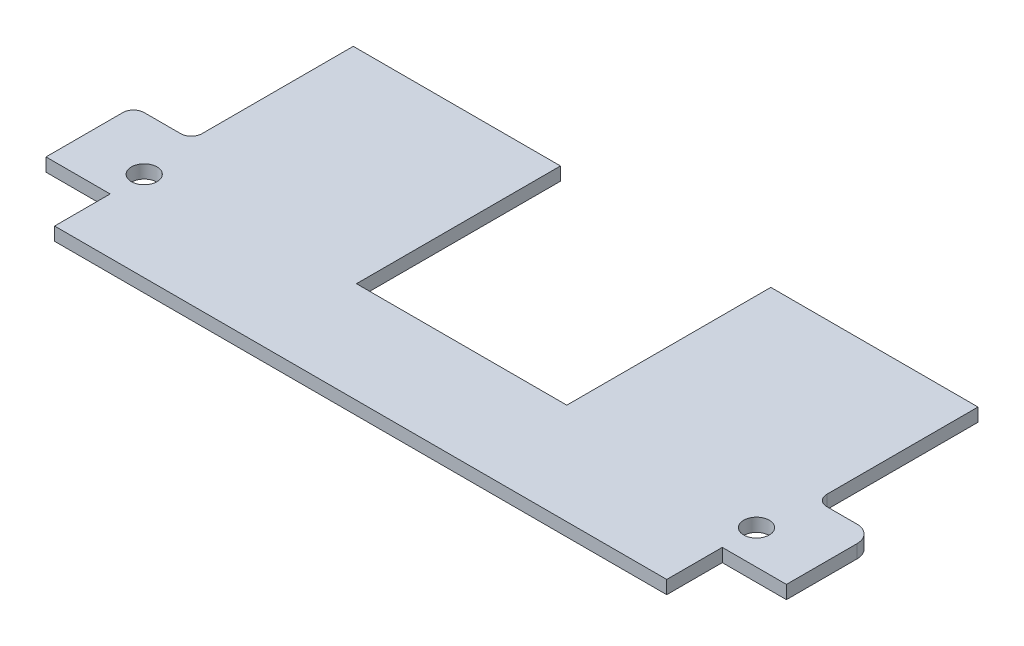
ISO-10303-21;
HEADER;
FILE_DESCRIPTION(('STEP AP214'),'2;1');
FILE_NAME('part.step','',(''),(''),'','','');
FILE_SCHEMA(('AUTOMOTIVE_DESIGN { 1 0 10303 214 1 1 1 1 }'));
ENDSEC;
DATA;
#1=APPLICATION_CONTEXT('core data for automotive mechanical design processes');
#2=APPLICATION_PROTOCOL_DEFINITION('international standard','automotive_design',2000,#1);
#3=PRODUCT_CONTEXT('',#1,'mechanical');
#4=PRODUCT('Part','Part','',(#3));
#5=PRODUCT_RELATED_PRODUCT_CATEGORY('part','',(#4));
#6=PRODUCT_DEFINITION_FORMATION('','',#4);
#7=PRODUCT_DEFINITION_CONTEXT('part definition',#1,'design');
#8=PRODUCT_DEFINITION('design','',#6,#7);
#9=PRODUCT_DEFINITION_SHAPE('','',#8);
#10=(LENGTH_UNIT() NAMED_UNIT(*) SI_UNIT(.MILLI.,.METRE.));
#11=(NAMED_UNIT(*) PLANE_ANGLE_UNIT() SI_UNIT($,.RADIAN.));
#12=(NAMED_UNIT(*) SI_UNIT($,.STERADIAN.) SOLID_ANGLE_UNIT());
#13=UNCERTAINTY_MEASURE_WITH_UNIT(LENGTH_MEASURE(1.E-05),#10,'distance_accuracy_value','');
#14=(GEOMETRIC_REPRESENTATION_CONTEXT(3) GLOBAL_UNCERTAINTY_ASSIGNED_CONTEXT((#13)) GLOBAL_UNIT_ASSIGNED_CONTEXT((#10,
#11,#12)) REPRESENTATION_CONTEXT('',''));
#15=CARTESIAN_POINT('',(0.,0.,0.));
#16=DIRECTION('',(0.,0.,1.));
#17=DIRECTION('',(1.,0.,0.));
#18=AXIS2_PLACEMENT_3D('',#15,#16,#17);
#19=CARTESIAN_POINT('',(42.3512933071951,1.575,31.615946891947));
#20=DIRECTION('',(0.,1.,0.));
#21=DIRECTION('',(0.,0.,1.));
#22=AXIS2_PLACEMENT_3D('',#19,#20,#21);
#23=PLANE('',#22);
#24=CARTESIAN_POINT('',(36.7272933151951,1.575,35.947946891947));
#25=DIRECTION('',(0.,1.,0.));
#26=DIRECTION('',(0.,0.,1.));
#27=AXIS2_PLACEMENT_3D('',#24,#25,#26);
#28=CIRCLE('',#27,1.52399999234956);
#29=CARTESIAN_POINT('',(36.7272933151951,1.575,37.4719468842965));
#30=VERTEX_POINT('',#29);
#31=EDGE_CURVE('E220',#30,#30,#28,.T.);
#32=ORIENTED_EDGE('',*,*,#31,.F.);
#33=EDGE_LOOP('',(#32));
#34=FACE_BOUND('',#33,.T.);
#35=DIRECTION('',(1.,0.,0.));
#36=VECTOR('',#35,1.);
#37=CARTESIAN_POINT('',(-29.6747066928049,1.575,46.615946891947));
#38=LINE('',#37,#36);
#39=CARTESIAN_POINT('',(-36.0247067008049,1.575,46.615946891947));
#40=VERTEX_POINT('',#39);
#41=CARTESIAN_POINT('',(36.7272933151951,1.575,46.615946891947));
#42=VERTEX_POINT('',#41);
#43=EDGE_CURVE('E59',#40,#42,#38,.T.);
#44=ORIENTED_EDGE('',*,*,#43,.T.);
#45=DIRECTION('',(0.,0.,-1.));
#46=VECTOR('',#45,1.);
#47=CARTESIAN_POINT('',(36.7272933151951,1.575,40.0144122461493));
#48=LINE('',#47,#46);
#49=CARTESIAN_POINT('',(36.7272933151951,1.575,40.0144122461493));
#50=VERTEX_POINT('',#49);
#51=EDGE_CURVE('E417',#42,#50,#48,.T.);
#52=ORIENTED_EDGE('',*,*,#51,.T.);
#53=DIRECTION('',(1.,0.,0.));
#54=VECTOR('',#53,1.);
#55=CARTESIAN_POINT('',(44.3512933071951,1.575,40.0144122461493));
#56=LINE('',#55,#54);
#57=CARTESIAN_POINT('',(44.3512933071951,1.575,40.0144122461493));
#58=VERTEX_POINT('',#57);
#59=EDGE_CURVE('E345',#50,#58,#56,.T.);
#60=ORIENTED_EDGE('',*,*,#59,.T.);
#61=DIRECTION('',(0.,0.,-1.));
#62=VECTOR('',#61,1.);
#63=CARTESIAN_POINT('',(44.3512933071951,1.575,40.0144122461493));
#64=LINE('',#63,#62);
#65=CARTESIAN_POINT('',(44.3512933071951,1.575,31.615946891947));
#66=VERTEX_POINT('',#65);
#67=EDGE_CURVE('E368',#58,#66,#64,.T.);
#68=ORIENTED_EDGE('',*,*,#67,.T.);
#69=CARTESIAN_POINT('',(42.3512933071951,1.575,31.615946891947));
#70=DIRECTION('',(0.,1.,0.));
#71=DIRECTION('',(0.,0.,1.));
#72=AXIS2_PLACEMENT_3D('',#69,#70,#71);
#73=CIRCLE('',#72,2.);
#74=CARTESIAN_POINT('',(42.3512933071951,1.575,29.615946891947));
#75=VERTEX_POINT('',#74);
#76=EDGE_CURVE('E364',#66,#75,#73,.T.);
#77=ORIENTED_EDGE('',*,*,#76,.T.);
#78=DIRECTION('',(-1.,0.,0.));
#79=VECTOR('',#78,1.);
#80=CARTESIAN_POINT('',(42.3512933071951,1.575,29.615946891947));
#81=LINE('',#80,#79);
#82=CARTESIAN_POINT('',(38.7462933071951,1.575,29.615946891947));
#83=VERTEX_POINT('',#82);
#84=EDGE_CURVE('E367',#75,#83,#81,.T.);
#85=ORIENTED_EDGE('',*,*,#84,.T.);
#86=CARTESIAN_POINT('',(38.7462933071951,1.575,28.345946891947));
#87=DIRECTION('',(0.,-1.,0.));
#88=DIRECTION('',(0.,0.,1.));
#89=AXIS2_PLACEMENT_3D('',#86,#87,#88);
#90=CIRCLE('',#89,1.26999999999999);
#91=CARTESIAN_POINT('',(37.4762933071951,1.575,28.345946891947));
#92=VERTEX_POINT('',#91);
#93=EDGE_CURVE('E372',#83,#92,#90,.T.);
#94=ORIENTED_EDGE('',*,*,#93,.T.);
#95=DIRECTION('',(0.,0.,-1.));
#96=VECTOR('',#95,1.);
#97=CARTESIAN_POINT('',(37.4762933071951,1.575,28.345946891947));
#98=LINE('',#97,#96);
#99=CARTESIAN_POINT('',(37.4762933071951,1.575,10.3704284449379));
#100=VERTEX_POINT('',#99);
#101=EDGE_CURVE('E379',#92,#100,#98,.T.);
#102=ORIENTED_EDGE('',*,*,#101,.T.);
#103=DIRECTION('',(-1.,0.,0.));
#104=VECTOR('',#103,1.);
#105=CARTESIAN_POINT('',(12.8512933071951,1.575,10.3704284449379));
#106=LINE('',#105,#104);
#107=CARTESIAN_POINT('',(12.8512933071951,1.575,10.3704284449379));
#108=VERTEX_POINT('',#107);
#109=EDGE_CURVE('E382',#100,#108,#106,.T.);
#110=ORIENTED_EDGE('',*,*,#109,.T.);
#111=DIRECTION('',(0.,0.,1.));
#112=VECTOR('',#111,1.);
#113=CARTESIAN_POINT('',(12.8512933071951,1.575,10.3704284449379));
#114=LINE('',#113,#112);
#115=CARTESIAN_POINT('',(12.8512933071951,1.575,34.615947015947));
#116=VERTEX_POINT('',#115);
#117=EDGE_CURVE('E385',#108,#116,#114,.T.);
#118=ORIENTED_EDGE('',*,*,#117,.T.);
#119=DIRECTION('',(-1.,0.,0.));
#120=VECTOR('',#119,1.);
#121=CARTESIAN_POINT('',(-12.1487066928049,1.575,34.615947015947));
#122=LINE('',#121,#120);
#123=CARTESIAN_POINT('',(-12.1487066928049,1.575,34.615947015947));
#124=VERTEX_POINT('',#123);
#125=EDGE_CURVE('E388',#116,#124,#122,.T.);
#126=ORIENTED_EDGE('',*,*,#125,.T.);
#127=DIRECTION('',(0.,0.,-1.));
#128=VECTOR('',#127,1.);
#129=CARTESIAN_POINT('',(-12.1487066928049,1.575,17.871301307947));
#130=LINE('',#129,#128);
#131=CARTESIAN_POINT('',(-12.1487066928049,1.575,10.3704284449379));
#132=VERTEX_POINT('',#131);
#133=EDGE_CURVE('E391',#124,#132,#130,.T.);
#134=ORIENTED_EDGE('',*,*,#133,.T.);
#135=DIRECTION('',(-1.,0.,0.));
#136=VECTOR('',#135,1.);
#137=CARTESIAN_POINT('',(-36.7737066928049,1.575,10.3704284449379));
#138=LINE('',#137,#136);
#139=CARTESIAN_POINT('',(-36.7737066928049,1.575,10.3704284449379));
#140=VERTEX_POINT('',#139);
#141=EDGE_CURVE('E394',#132,#140,#138,.T.);
#142=ORIENTED_EDGE('',*,*,#141,.T.);
#143=DIRECTION('',(0.,0.,1.));
#144=VECTOR('',#143,1.);
#145=CARTESIAN_POINT('',(-36.7737066928049,1.575,10.3704284449379));
#146=LINE('',#145,#144);
#147=CARTESIAN_POINT('',(-36.7737066928049,1.575,28.345946891947));
#148=VERTEX_POINT('',#147);
#149=EDGE_CURVE('E397',#140,#148,#146,.T.);
#150=ORIENTED_EDGE('',*,*,#149,.T.);
#151=CARTESIAN_POINT('',(-38.0437066928049,1.575,28.345946891947));
#152=DIRECTION('',(0.,-1.,0.));
#153=DIRECTION('',(0.,0.,1.));
#154=AXIS2_PLACEMENT_3D('',#151,#152,#153);
#155=CIRCLE('',#154,1.26999999999999);
#156=CARTESIAN_POINT('',(-38.0437066928049,1.575,29.615946891947));
#157=VERTEX_POINT('',#156);
#158=EDGE_CURVE('E400',#148,#157,#155,.T.);
#159=ORIENTED_EDGE('',*,*,#158,.T.);
#160=DIRECTION('',(-1.,0.,0.));
#161=VECTOR('',#160,1.);
#162=CARTESIAN_POINT('',(-38.0437066928049,1.575,29.615946891947));
#163=LINE('',#162,#161);
#164=CARTESIAN_POINT('',(-42.3787066928049,1.575,29.615946891947));
#165=VERTEX_POINT('',#164);
#166=EDGE_CURVE('E403',#157,#165,#163,.T.);
#167=ORIENTED_EDGE('',*,*,#166,.T.);
#168=CARTESIAN_POINT('',(-42.3787066928049,1.575,30.885946891947));
#169=DIRECTION('',(0.,1.,0.));
#170=DIRECTION('',(0.,0.,1.));
#171=AXIS2_PLACEMENT_3D('',#168,#169,#170);
#172=CIRCLE('',#171,1.26999999999999);
#173=CARTESIAN_POINT('',(-43.6487066928049,1.575,30.885946891947));
#174=VERTEX_POINT('',#173);
#175=EDGE_CURVE('E191',#165,#174,#172,.T.);
#176=ORIENTED_EDGE('',*,*,#175,.T.);
#177=DIRECTION('',(0.,0.,1.));
#178=VECTOR('',#177,1.);
#179=CARTESIAN_POINT('',(-43.6487066928049,1.575,30.885946891947));
#180=LINE('',#179,#178);
#181=CARTESIAN_POINT('',(-43.6487066928049,1.575,40.0144122461493));
#182=VERTEX_POINT('',#181);
#183=EDGE_CURVE('E185',#174,#182,#180,.T.);
#184=ORIENTED_EDGE('',*,*,#183,.T.);
#185=DIRECTION('',(1.,0.,0.));
#186=VECTOR('',#185,1.);
#187=CARTESIAN_POINT('',(-36.0247067008049,1.575,40.0144122461493));
#188=LINE('',#187,#186);
#189=CARTESIAN_POINT('',(-36.0247067008049,1.575,40.0144122461493));
#190=VERTEX_POINT('',#189);
#191=EDGE_CURVE('E189',#182,#190,#188,.T.);
#192=ORIENTED_EDGE('',*,*,#191,.T.);
#193=DIRECTION('',(0.,0.,1.));
#194=VECTOR('',#193,1.);
#195=CARTESIAN_POINT('',(-36.0247067008049,1.575,40.0144122461493));
#196=LINE('',#195,#194);
#197=EDGE_CURVE('E208',#190,#40,#196,.T.);
#198=ORIENTED_EDGE('',*,*,#197,.T.);
#199=EDGE_LOOP('',(#44,#52,#60,#68,#77,#85,#94,#102,#110,#118,#126,#134,#142,#150,#159,#167,
#176,#184,#192,#198));
#200=FACE_BOUND('',#199,.T.);
#201=CARTESIAN_POINT('',(-36.0247067008049,1.575,35.965946891947));
#202=DIRECTION('',(0.,1.,0.));
#203=DIRECTION('',(0.,0.,1.));
#204=AXIS2_PLACEMENT_3D('',#201,#202,#203);
#205=CIRCLE('',#204,1.52400000765045);
#206=CARTESIAN_POINT('',(-36.0247067008049,1.575,37.4899468995974));
#207=VERTEX_POINT('',#206);
#208=EDGE_CURVE('E429',#207,#207,#205,.T.);
#209=ORIENTED_EDGE('',*,*,#208,.F.);
#210=EDGE_LOOP('',(#209));
#211=FACE_BOUND('',#210,.T.);
#212=ADVANCED_FACE('F41',(#34,#200,#211),#23,.T.);
#213=CARTESIAN_POINT('',(42.3512933071951,0.,31.615946891947));
#214=DIRECTION('',(0.,1.,0.));
#215=DIRECTION('',(0.,0.,1.));
#216=AXIS2_PLACEMENT_3D('',#213,#214,#215);
#217=PLANE('',#216);
#218=CARTESIAN_POINT('',(36.7272933151951,0.,35.947946891947));
#219=DIRECTION('',(0.,1.,0.));
#220=DIRECTION('',(0.,0.,1.));
#221=AXIS2_PLACEMENT_3D('',#218,#219,#220);
#222=CIRCLE('',#221,1.52399999234956);
#223=CARTESIAN_POINT('',(36.7272933151951,0.,37.4719468842965));
#224=VERTEX_POINT('',#223);
#225=EDGE_CURVE('E425',#224,#224,#222,.T.);
#226=ORIENTED_EDGE('',*,*,#225,.T.);
#227=EDGE_LOOP('',(#226));
#228=FACE_BOUND('',#227,.T.);
#229=DIRECTION('',(0.,0.,-1.));
#230=VECTOR('',#229,1.);
#231=CARTESIAN_POINT('',(36.7272933151951,0.,40.0144122461493));
#232=LINE('',#231,#230);
#233=CARTESIAN_POINT('',(36.7272933151951,0.,46.615946891947));
#234=VERTEX_POINT('',#233);
#235=CARTESIAN_POINT('',(36.7272933151951,0.,40.0144122461493));
#236=VERTEX_POINT('',#235);
#237=EDGE_CURVE('E216',#234,#236,#232,.T.);
#238=ORIENTED_EDGE('',*,*,#237,.F.);
#239=DIRECTION('',(1.,0.,0.));
#240=VECTOR('',#239,1.);
#241=CARTESIAN_POINT('',(-36.0247067008049,0.,46.615946891947));
#242=LINE('',#241,#240);
#243=CARTESIAN_POINT('',(-36.0247067008049,0.,46.615946891947));
#244=VERTEX_POINT('',#243);
#245=EDGE_CURVE('E273',#244,#234,#242,.T.);
#246=ORIENTED_EDGE('',*,*,#245,.F.);
#247=DIRECTION('',(0.,0.,1.));
#248=VECTOR('',#247,1.);
#249=CARTESIAN_POINT('',(-36.0247067008049,0.,40.0144122461493));
#250=LINE('',#249,#248);
#251=CARTESIAN_POINT('',(-36.0247067008049,0.,40.0144122461493));
#252=VERTEX_POINT('',#251);
#253=EDGE_CURVE('E132',#252,#244,#250,.T.);
#254=ORIENTED_EDGE('',*,*,#253,.F.);
#255=DIRECTION('',(1.,0.,0.));
#256=VECTOR('',#255,1.);
#257=CARTESIAN_POINT('',(-36.0247067008049,0.,40.0144122461493));
#258=LINE('',#257,#256);
#259=CARTESIAN_POINT('',(-43.6487066928049,0.,40.0144122461493));
#260=VERTEX_POINT('',#259);
#261=EDGE_CURVE('E125',#260,#252,#258,.T.);
#262=ORIENTED_EDGE('',*,*,#261,.F.);
#263=DIRECTION('',(0.,0.,1.));
#264=VECTOR('',#263,1.);
#265=CARTESIAN_POINT('',(-43.6487066928049,0.,30.885946891947));
#266=LINE('',#265,#264);
#267=CARTESIAN_POINT('',(-43.6487066928049,0.,30.885946891947));
#268=VERTEX_POINT('',#267);
#269=EDGE_CURVE('E200',#268,#260,#266,.T.);
#270=ORIENTED_EDGE('',*,*,#269,.F.);
#271=CARTESIAN_POINT('',(-42.3787066928049,0.,30.885946891947));
#272=DIRECTION('',(0.,1.,0.));
#273=DIRECTION('',(0.,0.,1.));
#274=AXIS2_PLACEMENT_3D('',#271,#272,#273);
#275=CIRCLE('',#274,1.26999999999999);
#276=CARTESIAN_POINT('',(-42.3787066928049,0.,29.615946891947));
#277=VERTEX_POINT('',#276);
#278=EDGE_CURVE('E264',#277,#268,#275,.T.);
#279=ORIENTED_EDGE('',*,*,#278,.F.);
#280=DIRECTION('',(-1.,0.,0.));
#281=VECTOR('',#280,1.);
#282=CARTESIAN_POINT('',(-38.0437066928049,0.,29.615946891947));
#283=LINE('',#282,#281);
#284=CARTESIAN_POINT('',(-38.0437066928049,0.,29.615946891947));
#285=VERTEX_POINT('',#284);
#286=EDGE_CURVE('E261',#285,#277,#283,.T.);
#287=ORIENTED_EDGE('',*,*,#286,.F.);
#288=CARTESIAN_POINT('',(-38.0437066928049,0.,28.345946891947));
#289=DIRECTION('',(0.,-1.,0.));
#290=DIRECTION('',(0.,0.,1.));
#291=AXIS2_PLACEMENT_3D('',#288,#289,#290);
#292=CIRCLE('',#291,1.26999999999999);
#293=CARTESIAN_POINT('',(-36.7737066928049,0.,28.345946891947));
#294=VERTEX_POINT('',#293);
#295=EDGE_CURVE('E258',#294,#285,#292,.T.);
#296=ORIENTED_EDGE('',*,*,#295,.F.);
#297=DIRECTION('',(0.,0.,1.));
#298=VECTOR('',#297,1.);
#299=CARTESIAN_POINT('',(-36.7737066928049,0.,10.3704284449379));
#300=LINE('',#299,#298);
#301=CARTESIAN_POINT('',(-36.7737066928049,0.,10.3704284449379));
#302=VERTEX_POINT('',#301);
#303=EDGE_CURVE('E255',#302,#294,#300,.T.);
#304=ORIENTED_EDGE('',*,*,#303,.F.);
#305=DIRECTION('',(-1.,0.,0.));
#306=VECTOR('',#305,1.);
#307=CARTESIAN_POINT('',(-36.7737066928049,0.,10.3704284449379));
#308=LINE('',#307,#306);
#309=CARTESIAN_POINT('',(-12.1487066928049,0.,10.3704284449379));
#310=VERTEX_POINT('',#309);
#311=EDGE_CURVE('E252',#310,#302,#308,.T.);
#312=ORIENTED_EDGE('',*,*,#311,.F.);
#313=DIRECTION('',(0.,0.,-1.));
#314=VECTOR('',#313,1.);
#315=CARTESIAN_POINT('',(-12.1487066928049,0.,17.871301307947));
#316=LINE('',#315,#314);
#317=CARTESIAN_POINT('',(-12.1487066928049,0.,34.615947015947));
#318=VERTEX_POINT('',#317);
#319=EDGE_CURVE('E249',#318,#310,#316,.T.);
#320=ORIENTED_EDGE('',*,*,#319,.F.);
#321=DIRECTION('',(-1.,0.,0.));
#322=VECTOR('',#321,1.);
#323=CARTESIAN_POINT('',(-12.1487066928049,0.,34.615947015947));
#324=LINE('',#323,#322);
#325=CARTESIAN_POINT('',(12.8512933071951,0.,34.615947015947));
#326=VERTEX_POINT('',#325);
#327=EDGE_CURVE('E245',#326,#318,#324,.T.);
#328=ORIENTED_EDGE('',*,*,#327,.F.);
#329=DIRECTION('',(0.,0.,1.));
#330=VECTOR('',#329,1.);
#331=CARTESIAN_POINT('',(12.8512933071951,0.,17.871301307947));
#332=LINE('',#331,#330);
#333=CARTESIAN_POINT('',(12.8512933071951,0.,10.3704284449379));
#334=VERTEX_POINT('',#333);
#335=EDGE_CURVE('E242',#334,#326,#332,.T.);
#336=ORIENTED_EDGE('',*,*,#335,.F.);
#337=DIRECTION('',(-1.,0.,0.));
#338=VECTOR('',#337,1.);
#339=CARTESIAN_POINT('',(12.8512933071951,0.,10.3704284449379));
#340=LINE('',#339,#338);
#341=CARTESIAN_POINT('',(37.4762933071951,0.,10.3704284449379));
#342=VERTEX_POINT('',#341);
#343=EDGE_CURVE('E238',#342,#334,#340,.T.);
#344=ORIENTED_EDGE('',*,*,#343,.F.);
#345=DIRECTION('',(0.,0.,-1.));
#346=VECTOR('',#345,1.);
#347=CARTESIAN_POINT('',(37.4762933071951,0.,28.345946891947));
#348=LINE('',#347,#346);
#349=CARTESIAN_POINT('',(37.4762933071951,0.,28.345946891947));
#350=VERTEX_POINT('',#349);
#351=EDGE_CURVE('E235',#350,#342,#348,.T.);
#352=ORIENTED_EDGE('',*,*,#351,.F.);
#353=CARTESIAN_POINT('',(38.7462933071951,0.,28.345946891947));
#354=DIRECTION('',(0.,-1.,0.));
#355=DIRECTION('',(0.,0.,1.));
#356=AXIS2_PLACEMENT_3D('',#353,#354,#355);
#357=CIRCLE('',#356,1.26999999999999);
#358=CARTESIAN_POINT('',(38.7462933071951,0.,29.615946891947));
#359=VERTEX_POINT('',#358);
#360=EDGE_CURVE('E232',#359,#350,#357,.T.);
#361=ORIENTED_EDGE('',*,*,#360,.F.);
#362=DIRECTION('',(-1.,0.,0.));
#363=VECTOR('',#362,1.);
#364=CARTESIAN_POINT('',(42.3512933071951,0.,29.615946891947));
#365=LINE('',#364,#363);
#366=CARTESIAN_POINT('',(42.3512933071951,0.,29.615946891947));
#367=VERTEX_POINT('',#366);
#368=EDGE_CURVE('E229',#367,#359,#365,.T.);
#369=ORIENTED_EDGE('',*,*,#368,.F.);
#370=CARTESIAN_POINT('',(42.3512933071951,0.,31.615946891947));
#371=DIRECTION('',(0.,1.,0.));
#372=DIRECTION('',(0.,0.,1.));
#373=AXIS2_PLACEMENT_3D('',#370,#371,#372);
#374=CIRCLE('',#373,2.);
#375=CARTESIAN_POINT('',(44.3512933071951,0.,31.615946891947));
#376=VERTEX_POINT('',#375);
#377=EDGE_CURVE('E226',#376,#367,#374,.T.);
#378=ORIENTED_EDGE('',*,*,#377,.F.);
#379=DIRECTION('',(0.,0.,-1.));
#380=VECTOR('',#379,1.);
#381=CARTESIAN_POINT('',(44.3512933071951,0.,40.0144122461493));
#382=LINE('',#381,#380);
#383=CARTESIAN_POINT('',(44.3512933071951,0.,40.0144122461493));
#384=VERTEX_POINT('',#383);
#385=EDGE_CURVE('E223',#384,#376,#382,.T.);
#386=ORIENTED_EDGE('',*,*,#385,.F.);
#387=DIRECTION('',(1.,0.,0.));
#388=VECTOR('',#387,1.);
#389=CARTESIAN_POINT('',(44.3512933071951,0.,40.0144122461493));
#390=LINE('',#389,#388);
#391=EDGE_CURVE('E219',#236,#384,#390,.T.);
#392=ORIENTED_EDGE('',*,*,#391,.F.);
#393=EDGE_LOOP('',(#238,#246,#254,#262,#270,#279,#287,#296,#304,#312,#320,#328,#336,#344,#352,
#361,#369,#378,#386,#392));
#394=FACE_BOUND('',#393,.T.);
#395=CARTESIAN_POINT('',(-36.0247067008049,0.,35.965946891947));
#396=DIRECTION('',(0.,1.,0.));
#397=DIRECTION('',(0.,0.,1.));
#398=AXIS2_PLACEMENT_3D('',#395,#396,#397);
#399=CIRCLE('',#398,1.52400000765045);
#400=CARTESIAN_POINT('',(-36.0247067008049,0.,37.4899468995974));
#401=VERTEX_POINT('',#400);
#402=EDGE_CURVE('E432',#401,#401,#399,.T.);
#403=ORIENTED_EDGE('',*,*,#402,.T.);
#404=EDGE_LOOP('',(#403));
#405=FACE_BOUND('',#404,.T.);
#406=ADVANCED_FACE('F351',(#228,#394,#405),#217,.F.);
#407=CARTESIAN_POINT('',(36.7272933151951,1.575,40.0144122461493));
#408=DIRECTION('',(-1.,0.,0.));
#409=DIRECTION('',(0.,0.,1.));
#410=AXIS2_PLACEMENT_3D('',#407,#408,#409);
#411=PLANE('',#410);
#412=ORIENTED_EDGE('',*,*,#237,.T.);
#413=DIRECTION('',(0.,-1.,0.));
#414=VECTOR('',#413,1.);
#415=CARTESIAN_POINT('',(36.7272933151951,1.575,40.0144122461493));
#416=LINE('',#415,#414);
#417=EDGE_CURVE('E51',#50,#236,#416,.T.);
#418=ORIENTED_EDGE('',*,*,#417,.F.);
#419=ORIENTED_EDGE('',*,*,#51,.F.);
#420=DIRECTION('',(0.,-1.,0.));
#421=VECTOR('',#420,1.);
#422=CARTESIAN_POINT('',(36.7272933151951,1.575,46.615946891947));
#423=LINE('',#422,#421);
#424=EDGE_CURVE('E11',#42,#234,#423,.T.);
#425=ORIENTED_EDGE('',*,*,#424,.T.);
#426=EDGE_LOOP('',(#412,#418,#419,#425));
#427=FACE_BOUND('',#426,.T.);
#428=ADVANCED_FACE('F43',(#427),#411,.F.);
#429=CARTESIAN_POINT('',(44.3512933071951,1.575,40.0144122461493));
#430=DIRECTION('',(0.,0.,-1.));
#431=DIRECTION('',(-1.,0.,0.));
#432=AXIS2_PLACEMENT_3D('',#429,#430,#431);
#433=PLANE('',#432);
#434=ORIENTED_EDGE('',*,*,#391,.T.);
#435=DIRECTION('',(0.,-1.,0.));
#436=VECTOR('',#435,1.);
#437=CARTESIAN_POINT('',(44.3512933071951,1.575,40.0144122461493));
#438=LINE('',#437,#436);
#439=EDGE_CURVE('E333',#58,#384,#438,.T.);
#440=ORIENTED_EDGE('',*,*,#439,.F.);
#441=ORIENTED_EDGE('',*,*,#59,.F.);
#442=ORIENTED_EDGE('',*,*,#417,.T.);
#443=EDGE_LOOP('',(#434,#440,#441,#442));
#444=FACE_BOUND('',#443,.T.);
#445=ADVANCED_FACE('F343',(#444),#433,.F.);
#446=CARTESIAN_POINT('',(44.3512933071951,1.575,40.0144122461493));
#447=DIRECTION('',(-1.,0.,0.));
#448=DIRECTION('',(0.,0.,1.));
#449=AXIS2_PLACEMENT_3D('',#446,#447,#448);
#450=PLANE('',#449);
#451=ORIENTED_EDGE('',*,*,#385,.T.);
#452=DIRECTION('',(0.,-1.,0.));
#453=VECTOR('',#452,1.);
#454=CARTESIAN_POINT('',(44.3512933071951,1.575,31.615946891947));
#455=LINE('',#454,#453);
#456=EDGE_CURVE('E329',#66,#376,#455,.T.);
#457=ORIENTED_EDGE('',*,*,#456,.F.);
#458=ORIENTED_EDGE('',*,*,#67,.F.);
#459=ORIENTED_EDGE('',*,*,#439,.T.);
#460=EDGE_LOOP('',(#451,#457,#458,#459));
#461=FACE_BOUND('',#460,.T.);
#462=ADVANCED_FACE('F358',(#461),#450,.F.);
#463=CARTESIAN_POINT('',(42.3512933071951,1.575,31.615946891947));
#464=DIRECTION('',(0.,-1.,0.));
#465=DIRECTION('',(0.,0.,-1.));
#466=AXIS2_PLACEMENT_3D('',#463,#464,#465);
#467=CYLINDRICAL_SURFACE('',#466,2.);
#468=ORIENTED_EDGE('',*,*,#377,.T.);
#469=DIRECTION('',(0.,-1.,0.));
#470=VECTOR('',#469,1.);
#471=CARTESIAN_POINT('',(42.3512933071951,1.575,29.615946891947));
#472=LINE('',#471,#470);
#473=EDGE_CURVE('E325',#75,#367,#472,.T.);
#474=ORIENTED_EDGE('',*,*,#473,.F.);
#475=ORIENTED_EDGE('',*,*,#76,.F.);
#476=ORIENTED_EDGE('',*,*,#456,.T.);
#477=EDGE_LOOP('',(#468,#474,#475,#476));
#478=FACE_BOUND('',#477,.T.);
#479=ADVANCED_FACE('F362',(#478),#467,.T.);
#480=CARTESIAN_POINT('',(42.3512933071951,1.575,29.615946891947));
#481=DIRECTION('',(0.,0.,1.));
#482=DIRECTION('',(1.,0.,0.));
#483=AXIS2_PLACEMENT_3D('',#480,#481,#482);
#484=PLANE('',#483);
#485=ORIENTED_EDGE('',*,*,#368,.T.);
#486=DIRECTION('',(0.,-1.,0.));
#487=VECTOR('',#486,1.);
#488=CARTESIAN_POINT('',(38.7462933071951,1.575,29.615946891947));
#489=LINE('',#488,#487);
#490=EDGE_CURVE('E321',#83,#359,#489,.T.);
#491=ORIENTED_EDGE('',*,*,#490,.F.);
#492=ORIENTED_EDGE('',*,*,#84,.F.);
#493=ORIENTED_EDGE('',*,*,#473,.T.);
#494=EDGE_LOOP('',(#485,#491,#492,#493));
#495=FACE_BOUND('',#494,.T.);
#496=ADVANCED_FACE('F502',(#495),#484,.F.);
#497=CARTESIAN_POINT('',(38.7462933071951,1.575,28.345946891947));
#498=DIRECTION('',(0.,-1.,0.));
#499=DIRECTION('',(0.,0.,-1.));
#500=AXIS2_PLACEMENT_3D('',#497,#498,#499);
#501=CYLINDRICAL_SURFACE('',#500,1.26999999999999);
#502=ORIENTED_EDGE('',*,*,#360,.T.);
#503=DIRECTION('',(0.,-1.,0.));
#504=VECTOR('',#503,1.);
#505=CARTESIAN_POINT('',(37.4762933071951,1.575,28.345946891947));
#506=LINE('',#505,#504);
#507=EDGE_CURVE('E317',#92,#350,#506,.T.);
#508=ORIENTED_EDGE('',*,*,#507,.F.);
#509=ORIENTED_EDGE('',*,*,#93,.F.);
#510=ORIENTED_EDGE('',*,*,#490,.T.);
#511=EDGE_LOOP('',(#502,#508,#509,#510));
#512=FACE_BOUND('',#511,.T.);
#513=ADVANCED_FACE('F498',(#512),#501,.F.);
#514=CARTESIAN_POINT('',(37.4762933071951,1.575,28.345946891947));
#515=DIRECTION('',(-1.,0.,0.));
#516=DIRECTION('',(0.,0.,1.));
#517=AXIS2_PLACEMENT_3D('',#514,#515,#516);
#518=PLANE('',#517);
#519=ORIENTED_EDGE('',*,*,#351,.T.);
#520=DIRECTION('',(0.,-1.,0.));
#521=VECTOR('',#520,1.);
#522=CARTESIAN_POINT('',(37.4762933071951,1.575,10.3704284449379));
#523=LINE('',#522,#521);
#524=EDGE_CURVE('E313',#100,#342,#523,.T.);
#525=ORIENTED_EDGE('',*,*,#524,.F.);
#526=ORIENTED_EDGE('',*,*,#101,.F.);
#527=ORIENTED_EDGE('',*,*,#507,.T.);
#528=EDGE_LOOP('',(#519,#525,#526,#527));
#529=FACE_BOUND('',#528,.T.);
#530=ADVANCED_FACE('F494',(#529),#518,.F.);
#531=CARTESIAN_POINT('',(12.8512933071951,1.575,10.3704284449379));
#532=DIRECTION('',(0.,0.,1.));
#533=DIRECTION('',(1.,0.,0.));
#534=AXIS2_PLACEMENT_3D('',#531,#532,#533);
#535=PLANE('',#534);
#536=ORIENTED_EDGE('',*,*,#343,.T.);
#537=DIRECTION('',(0.,-1.,0.));
#538=VECTOR('',#537,1.);
#539=CARTESIAN_POINT('',(12.8512933071951,1.575,10.3704284449379));
#540=LINE('',#539,#538);
#541=EDGE_CURVE('E309',#108,#334,#540,.T.);
#542=ORIENTED_EDGE('',*,*,#541,.F.);
#543=ORIENTED_EDGE('',*,*,#109,.F.);
#544=ORIENTED_EDGE('',*,*,#524,.T.);
#545=EDGE_LOOP('',(#536,#542,#543,#544));
#546=FACE_BOUND('',#545,.T.);
#547=ADVANCED_FACE('F490',(#546),#535,.F.);
#548=CARTESIAN_POINT('',(12.8512933071951,1.575,17.871301307947));
#549=DIRECTION('',(1.,0.,0.));
#550=DIRECTION('',(0.,0.,-1.));
#551=AXIS2_PLACEMENT_3D('',#548,#549,#550);
#552=PLANE('',#551);
#553=ORIENTED_EDGE('',*,*,#335,.T.);
#554=DIRECTION('',(0.,-1.,0.));
#555=VECTOR('',#554,1.);
#556=CARTESIAN_POINT('',(12.8512933071951,1.575,34.615947015947));
#557=LINE('',#556,#555);
#558=EDGE_CURVE('E305',#116,#326,#557,.T.);
#559=ORIENTED_EDGE('',*,*,#558,.F.);
#560=ORIENTED_EDGE('',*,*,#117,.F.);
#561=ORIENTED_EDGE('',*,*,#541,.T.);
#562=EDGE_LOOP('',(#553,#559,#560,#561));
#563=FACE_BOUND('',#562,.T.);
#564=ADVANCED_FACE('F486',(#563),#552,.F.);
#565=CARTESIAN_POINT('',(-12.1487066928049,1.575,34.615947015947));
#566=DIRECTION('',(0.,0.,1.));
#567=DIRECTION('',(1.,0.,0.));
#568=AXIS2_PLACEMENT_3D('',#565,#566,#567);
#569=PLANE('',#568);
#570=ORIENTED_EDGE('',*,*,#327,.T.);
#571=DIRECTION('',(0.,-1.,0.));
#572=VECTOR('',#571,1.);
#573=CARTESIAN_POINT('',(-12.1487066928049,1.575,34.615947015947));
#574=LINE('',#573,#572);
#575=EDGE_CURVE('E301',#124,#318,#574,.T.);
#576=ORIENTED_EDGE('',*,*,#575,.F.);
#577=ORIENTED_EDGE('',*,*,#125,.F.);
#578=ORIENTED_EDGE('',*,*,#558,.T.);
#579=EDGE_LOOP('',(#570,#576,#577,#578));
#580=FACE_BOUND('',#579,.T.);
#581=ADVANCED_FACE('F482',(#580),#569,.F.);
#582=CARTESIAN_POINT('',(-12.1487066928049,1.575,17.871301307947));
#583=DIRECTION('',(-1.,0.,0.));
#584=DIRECTION('',(0.,0.,1.));
#585=AXIS2_PLACEMENT_3D('',#582,#583,#584);
#586=PLANE('',#585);
#587=ORIENTED_EDGE('',*,*,#319,.T.);
#588=DIRECTION('',(0.,-1.,0.));
#589=VECTOR('',#588,1.);
#590=CARTESIAN_POINT('',(-12.1487066928049,1.575,10.3704284449379));
#591=LINE('',#590,#589);
#592=EDGE_CURVE('E297',#132,#310,#591,.T.);
#593=ORIENTED_EDGE('',*,*,#592,.F.);
#594=ORIENTED_EDGE('',*,*,#133,.F.);
#595=ORIENTED_EDGE('',*,*,#575,.T.);
#596=EDGE_LOOP('',(#587,#593,#594,#595));
#597=FACE_BOUND('',#596,.T.);
#598=ADVANCED_FACE('F478',(#597),#586,.F.);
#599=CARTESIAN_POINT('',(-36.7737066928049,1.575,10.3704284449379));
#600=DIRECTION('',(0.,0.,1.));
#601=DIRECTION('',(1.,0.,0.));
#602=AXIS2_PLACEMENT_3D('',#599,#600,#601);
#603=PLANE('',#602);
#604=ORIENTED_EDGE('',*,*,#311,.T.);
#605=DIRECTION('',(0.,-1.,0.));
#606=VECTOR('',#605,1.);
#607=CARTESIAN_POINT('',(-36.7737066928049,1.575,10.3704284449379));
#608=LINE('',#607,#606);
#609=EDGE_CURVE('E293',#140,#302,#608,.T.);
#610=ORIENTED_EDGE('',*,*,#609,.F.);
#611=ORIENTED_EDGE('',*,*,#141,.F.);
#612=ORIENTED_EDGE('',*,*,#592,.T.);
#613=EDGE_LOOP('',(#604,#610,#611,#612));
#614=FACE_BOUND('',#613,.T.);
#615=ADVANCED_FACE('F474',(#614),#603,.F.);
#616=CARTESIAN_POINT('',(-36.7737066928049,1.575,10.3704284449379));
#617=DIRECTION('',(1.,0.,0.));
#618=DIRECTION('',(0.,0.,-1.));
#619=AXIS2_PLACEMENT_3D('',#616,#617,#618);
#620=PLANE('',#619);
#621=ORIENTED_EDGE('',*,*,#303,.T.);
#622=DIRECTION('',(0.,-1.,0.));
#623=VECTOR('',#622,1.);
#624=CARTESIAN_POINT('',(-36.7737066928049,1.575,28.345946891947));
#625=LINE('',#624,#623);
#626=EDGE_CURVE('E289',#148,#294,#625,.T.);
#627=ORIENTED_EDGE('',*,*,#626,.F.);
#628=ORIENTED_EDGE('',*,*,#149,.F.);
#629=ORIENTED_EDGE('',*,*,#609,.T.);
#630=EDGE_LOOP('',(#621,#627,#628,#629));
#631=FACE_BOUND('',#630,.T.);
#632=ADVANCED_FACE('F470',(#631),#620,.F.);
#633=CARTESIAN_POINT('',(-38.0437066928049,1.575,28.345946891947));
#634=DIRECTION('',(0.,-1.,0.));
#635=DIRECTION('',(0.,0.,-1.));
#636=AXIS2_PLACEMENT_3D('',#633,#634,#635);
#637=CYLINDRICAL_SURFACE('',#636,1.26999999999999);
#638=ORIENTED_EDGE('',*,*,#295,.T.);
#639=DIRECTION('',(0.,-1.,0.));
#640=VECTOR('',#639,1.);
#641=CARTESIAN_POINT('',(-38.0437066928049,1.575,29.615946891947));
#642=LINE('',#641,#640);
#643=EDGE_CURVE('E285',#157,#285,#642,.T.);
#644=ORIENTED_EDGE('',*,*,#643,.F.);
#645=ORIENTED_EDGE('',*,*,#158,.F.);
#646=ORIENTED_EDGE('',*,*,#626,.T.);
#647=EDGE_LOOP('',(#638,#644,#645,#646));
#648=FACE_BOUND('',#647,.T.);
#649=ADVANCED_FACE('F467',(#648),#637,.F.);
#650=CARTESIAN_POINT('',(-38.0437066928049,1.575,29.615946891947));
#651=DIRECTION('',(0.,0.,1.));
#652=DIRECTION('',(1.,0.,0.));
#653=AXIS2_PLACEMENT_3D('',#650,#651,#652);
#654=PLANE('',#653);
#655=ORIENTED_EDGE('',*,*,#286,.T.);
#656=DIRECTION('',(0.,-1.,0.));
#657=VECTOR('',#656,1.);
#658=CARTESIAN_POINT('',(-42.3787066928049,1.575,29.615946891947));
#659=LINE('',#658,#657);
#660=EDGE_CURVE('E281',#165,#277,#659,.T.);
#661=ORIENTED_EDGE('',*,*,#660,.F.);
#662=ORIENTED_EDGE('',*,*,#166,.F.);
#663=ORIENTED_EDGE('',*,*,#643,.T.);
#664=EDGE_LOOP('',(#655,#661,#662,#663));
#665=FACE_BOUND('',#664,.T.);
#666=ADVANCED_FACE('F411',(#665),#654,.F.);
#667=CARTESIAN_POINT('',(-42.3787066928049,1.575,30.885946891947));
#668=DIRECTION('',(0.,-1.,0.));
#669=DIRECTION('',(0.,0.,-1.));
#670=AXIS2_PLACEMENT_3D('',#667,#668,#669);
#671=CYLINDRICAL_SURFACE('',#670,1.26999999999999);
#672=ORIENTED_EDGE('',*,*,#278,.T.);
#673=DIRECTION('',(0.,-1.,0.));
#674=VECTOR('',#673,1.);
#675=CARTESIAN_POINT('',(-43.6487066928049,1.575,30.885946891947));
#676=LINE('',#675,#674);
#677=EDGE_CURVE('E202',#174,#268,#676,.T.);
#678=ORIENTED_EDGE('',*,*,#677,.F.);
#679=ORIENTED_EDGE('',*,*,#175,.F.);
#680=ORIENTED_EDGE('',*,*,#660,.T.);
#681=EDGE_LOOP('',(#672,#678,#679,#680));
#682=FACE_BOUND('',#681,.T.);
#683=ADVANCED_FACE('F415',(#682),#671,.T.);
#684=CARTESIAN_POINT('',(-43.6487066928049,1.575,30.885946891947));
#685=DIRECTION('',(1.,0.,0.));
#686=DIRECTION('',(0.,0.,-1.));
#687=AXIS2_PLACEMENT_3D('',#684,#685,#686);
#688=PLANE('',#687);
#689=ORIENTED_EDGE('',*,*,#269,.T.);
#690=DIRECTION('',(0.,-1.,0.));
#691=VECTOR('',#690,1.);
#692=CARTESIAN_POINT('',(-43.6487066928049,1.575,40.0144122461493));
#693=LINE('',#692,#691);
#694=EDGE_CURVE('E197',#182,#260,#693,.T.);
#695=ORIENTED_EDGE('',*,*,#694,.F.);
#696=ORIENTED_EDGE('',*,*,#183,.F.);
#697=ORIENTED_EDGE('',*,*,#677,.T.);
#698=EDGE_LOOP('',(#689,#695,#696,#697));
#699=FACE_BOUND('',#698,.T.);
#700=ADVANCED_FACE('F198',(#699),#688,.F.);
#701=CARTESIAN_POINT('',(-36.0247067008049,1.575,40.0144122461493));
#702=DIRECTION('',(0.,0.,-1.));
#703=DIRECTION('',(-1.,0.,0.));
#704=AXIS2_PLACEMENT_3D('',#701,#702,#703);
#705=PLANE('',#704);
#706=ORIENTED_EDGE('',*,*,#261,.T.);
#707=DIRECTION('',(0.,-1.,0.));
#708=VECTOR('',#707,1.);
#709=CARTESIAN_POINT('',(-36.0247067008049,1.575,40.0144122461493));
#710=LINE('',#709,#708);
#711=EDGE_CURVE('E203',#190,#252,#710,.T.);
#712=ORIENTED_EDGE('',*,*,#711,.F.);
#713=ORIENTED_EDGE('',*,*,#191,.F.);
#714=ORIENTED_EDGE('',*,*,#694,.T.);
#715=EDGE_LOOP('',(#706,#712,#713,#714));
#716=FACE_BOUND('',#715,.T.);
#717=ADVANCED_FACE('F205',(#716),#705,.F.);
#718=CARTESIAN_POINT('',(-36.0247067008049,1.575,40.0144122461493));
#719=DIRECTION('',(1.,0.,0.));
#720=DIRECTION('',(0.,0.,-1.));
#721=AXIS2_PLACEMENT_3D('',#718,#719,#720);
#722=PLANE('',#721);
#723=ORIENTED_EDGE('',*,*,#253,.T.);
#724=DIRECTION('',(0.,-1.,0.));
#725=VECTOR('',#724,1.);
#726=CARTESIAN_POINT('',(-36.0247067008049,1.575,46.615946891947));
#727=LINE('',#726,#725);
#728=EDGE_CURVE('E212',#40,#244,#727,.T.);
#729=ORIENTED_EDGE('',*,*,#728,.F.);
#730=ORIENTED_EDGE('',*,*,#197,.F.);
#731=ORIENTED_EDGE('',*,*,#711,.T.);
#732=EDGE_LOOP('',(#723,#729,#730,#731));
#733=FACE_BOUND('',#732,.T.);
#734=ADVANCED_FACE('F456',(#733),#722,.F.);
#735=CARTESIAN_POINT('',(-36.0247067008049,1.575,46.615946891947));
#736=DIRECTION('',(0.,0.,-1.));
#737=DIRECTION('',(-1.,0.,0.));
#738=AXIS2_PLACEMENT_3D('',#735,#736,#737);
#739=PLANE('',#738);
#740=ORIENTED_EDGE('',*,*,#245,.T.);
#741=ORIENTED_EDGE('',*,*,#424,.F.);
#742=ORIENTED_EDGE('',*,*,#43,.F.);
#743=ORIENTED_EDGE('',*,*,#728,.T.);
#744=EDGE_LOOP('',(#740,#741,#742,#743));
#745=FACE_BOUND('',#744,.T.);
#746=ADVANCED_FACE('F416',(#745),#739,.F.);
#747=CARTESIAN_POINT('',(36.7272933151951,1.575,35.947946891947));
#748=DIRECTION('',(0.,-1.,0.));
#749=DIRECTION('',(0.,0.,-1.));
#750=AXIS2_PLACEMENT_3D('',#747,#748,#749);
#751=CYLINDRICAL_SURFACE('',#750,1.52399999234956);
#752=ORIENTED_EDGE('',*,*,#31,.T.);
#753=EDGE_LOOP('',(#752));
#754=FACE_BOUND('',#753,.T.);
#755=ORIENTED_EDGE('',*,*,#225,.F.);
#756=EDGE_LOOP('',(#755));
#757=FACE_BOUND('',#756,.T.);
#758=ADVANCED_FACE('F451',(#754,#757),#751,.F.);
#759=CARTESIAN_POINT('',(-36.0247067008049,1.575,35.965946891947));
#760=DIRECTION('',(0.,-1.,0.));
#761=DIRECTION('',(0.,0.,-1.));
#762=AXIS2_PLACEMENT_3D('',#759,#760,#761);
#763=CYLINDRICAL_SURFACE('',#762,1.52400000765045);
#764=ORIENTED_EDGE('',*,*,#208,.T.);
#765=EDGE_LOOP('',(#764));
#766=FACE_BOUND('',#765,.T.);
#767=ORIENTED_EDGE('',*,*,#402,.F.);
#768=EDGE_LOOP('',(#767));
#769=FACE_BOUND('',#768,.T.);
#770=ADVANCED_FACE('F439',(#766,#769),#763,.F.);
#771=CLOSED_SHELL('',(#212,#406,#428,#445,#462,#479,#496,#513,#530,#547,#564,#581,#598,#615,
#632,#649,#666,#683,#700,#717,#734,#746,#758,#770));
#772=MANIFOLD_SOLID_BREP('B2',#771);
#773=ADVANCED_BREP_SHAPE_REPRESENTATION('',(#18,#772),#14);
#774=SHAPE_DEFINITION_REPRESENTATION(#9,#773);
ENDSEC;
END-ISO-10303-21;
